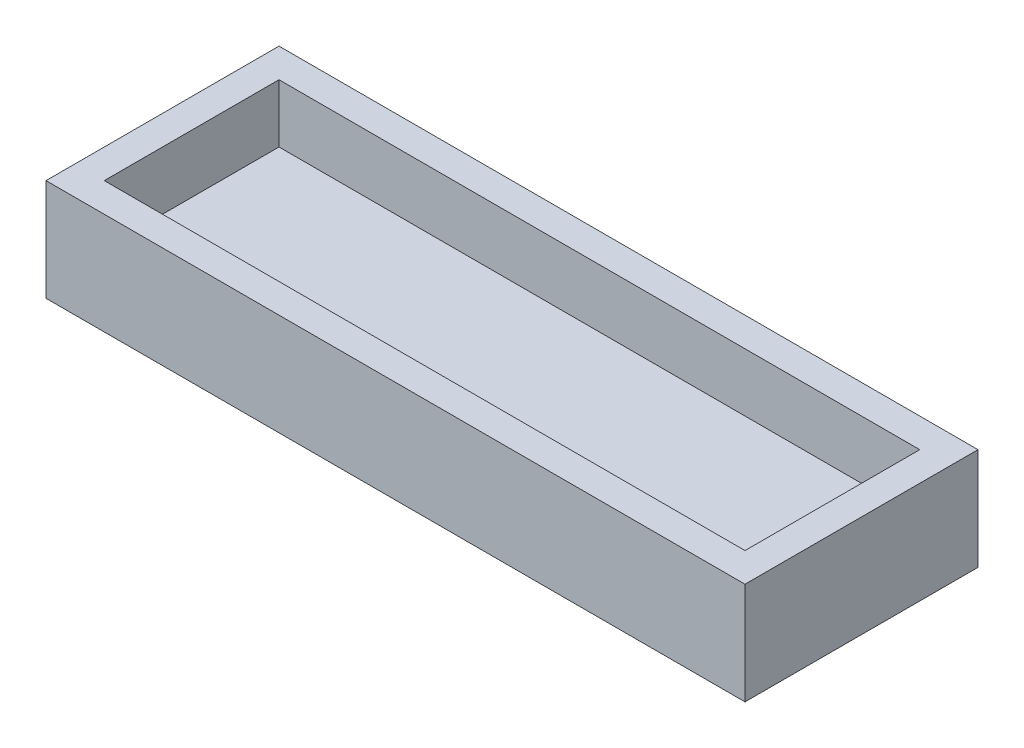
ISO-10303-21;
HEADER;
FILE_DESCRIPTION(('STEP AP214'),'2;1');
FILE_NAME('part.step','',(''),(''),'','','');
FILE_SCHEMA(('AUTOMOTIVE_DESIGN { 1 0 10303 214 1 1 1 1 }'));
ENDSEC;
DATA;
#1=APPLICATION_CONTEXT('core data for automotive mechanical design processes');
#2=APPLICATION_PROTOCOL_DEFINITION('international standard','automotive_design',2000,#1);
#3=PRODUCT_CONTEXT('',#1,'mechanical');
#4=PRODUCT('Part','Part','',(#3));
#5=PRODUCT_RELATED_PRODUCT_CATEGORY('part','',(#4));
#6=PRODUCT_DEFINITION_FORMATION('','',#4);
#7=PRODUCT_DEFINITION_CONTEXT('part definition',#1,'design');
#8=PRODUCT_DEFINITION('design','',#6,#7);
#9=PRODUCT_DEFINITION_SHAPE('','',#8);
#10=(LENGTH_UNIT() NAMED_UNIT(*) SI_UNIT(.MILLI.,.METRE.));
#11=(NAMED_UNIT(*) PLANE_ANGLE_UNIT() SI_UNIT($,.RADIAN.));
#12=(NAMED_UNIT(*) SI_UNIT($,.STERADIAN.) SOLID_ANGLE_UNIT());
#13=UNCERTAINTY_MEASURE_WITH_UNIT(LENGTH_MEASURE(1.E-05),#10,'distance_accuracy_value','');
#14=(GEOMETRIC_REPRESENTATION_CONTEXT(3) GLOBAL_UNCERTAINTY_ASSIGNED_CONTEXT((#13)) GLOBAL_UNIT_ASSIGNED_CONTEXT((#10,
#11,#12)) REPRESENTATION_CONTEXT('',''));
#15=CARTESIAN_POINT('',(0.,0.,0.));
#16=DIRECTION('',(0.,0.,1.));
#17=DIRECTION('',(1.,0.,0.));
#18=AXIS2_PLACEMENT_3D('',#15,#16,#17);
#19=CARTESIAN_POINT('',(0.,3.,0.));
#20=DIRECTION('',(0.,1.,0.));
#21=DIRECTION('',(0.,0.,1.));
#22=AXIS2_PLACEMENT_3D('',#19,#20,#21);
#23=PLANE('',#22);
#24=DIRECTION('',(0.,0.,-1.));
#25=VECTOR('',#24,1.);
#26=CARTESIAN_POINT('',(22.,3.,-6.));
#27=LINE('',#26,#25);
#28=CARTESIAN_POINT('',(22.,3.00000000000002,6.));
#29=VERTEX_POINT('',#28);
#30=CARTESIAN_POINT('',(22.,3.00000000000002,-6.));
#31=VERTEX_POINT('',#30);
#32=EDGE_CURVE('E145',#29,#31,#27,.T.);
#33=ORIENTED_EDGE('',*,*,#32,.T.);
#34=DIRECTION('',(-1.,0.,0.));
#35=VECTOR('',#34,1.);
#36=CARTESIAN_POINT('',(-22.,3.,-6.));
#37=LINE('',#36,#35);
#38=CARTESIAN_POINT('',(-22.,3.,-6.));
#39=VERTEX_POINT('',#38);
#40=EDGE_CURVE('E162',#31,#39,#37,.T.);
#41=ORIENTED_EDGE('',*,*,#40,.T.);
#42=DIRECTION('',(0.,0.,1.));
#43=VECTOR('',#42,1.);
#44=CARTESIAN_POINT('',(-22.,3.,-6.));
#45=LINE('',#44,#43);
#46=CARTESIAN_POINT('',(-22.,3.00000000000002,6.));
#47=VERTEX_POINT('',#46);
#48=EDGE_CURVE('E45',#39,#47,#45,.T.);
#49=ORIENTED_EDGE('',*,*,#48,.T.);
#50=DIRECTION('',(1.,0.,0.));
#51=VECTOR('',#50,1.);
#52=CARTESIAN_POINT('',(-22.,3.,6.));
#53=LINE('',#52,#51);
#54=EDGE_CURVE('E12',#47,#29,#53,.T.);
#55=ORIENTED_EDGE('',*,*,#54,.T.);
#56=EDGE_LOOP('',(#33,#41,#49,#55));
#57=FACE_BOUND('',#56,.T.);
#58=ADVANCED_FACE('F37',(#57),#23,.T.);
#59=CARTESIAN_POINT('',(24.,61.5964425626941,-8.));
#60=DIRECTION('',(0.,0.,-1.));
#61=DIRECTION('',(-1.,0.,0.));
#62=AXIS2_PLACEMENT_3D('',#59,#60,#61);
#63=PLANE('',#62);
#64=DIRECTION('',(0.,-1.,0.));
#65=VECTOR('',#64,1.);
#66=CARTESIAN_POINT('',(-24.,61.5964425626941,-8.));
#67=LINE('',#66,#65);
#68=CARTESIAN_POINT('',(-24.,7.,-8.));
#69=VERTEX_POINT('',#68);
#70=CARTESIAN_POINT('',(-24.,0.,-8.));
#71=VERTEX_POINT('',#70);
#72=EDGE_CURVE('E113',#69,#71,#67,.T.);
#73=ORIENTED_EDGE('',*,*,#72,.F.);
#74=DIRECTION('',(1.,0.,0.));
#75=VECTOR('',#74,1.);
#76=CARTESIAN_POINT('',(24.,7.,-8.));
#77=LINE('',#76,#75);
#78=CARTESIAN_POINT('',(24.,7.,-8.));
#79=VERTEX_POINT('',#78);
#80=EDGE_CURVE('E146',#69,#79,#77,.T.);
#81=ORIENTED_EDGE('',*,*,#80,.T.);
#82=DIRECTION('',(0.,-1.,0.));
#83=VECTOR('',#82,1.);
#84=CARTESIAN_POINT('',(24.,61.5964425626941,-8.));
#85=LINE('',#84,#83);
#86=CARTESIAN_POINT('',(24.,0.,-8.));
#87=VERTEX_POINT('',#86);
#88=EDGE_CURVE('E127',#79,#87,#85,.T.);
#89=ORIENTED_EDGE('',*,*,#88,.T.);
#90=DIRECTION('',(1.,0.,0.));
#91=VECTOR('',#90,1.);
#92=CARTESIAN_POINT('',(24.,0.,-8.));
#93=LINE('',#92,#91);
#94=EDGE_CURVE('E132',#71,#87,#93,.T.);
#95=ORIENTED_EDGE('',*,*,#94,.F.);
#96=EDGE_LOOP('',(#73,#81,#89,#95));
#97=FACE_BOUND('',#96,.T.);
#98=ADVANCED_FACE('F184',(#97),#63,.T.);
#99=CARTESIAN_POINT('',(-24.,61.5964425626941,-8.));
#100=DIRECTION('',(-1.,0.,0.));
#101=DIRECTION('',(0.,0.,1.));
#102=AXIS2_PLACEMENT_3D('',#99,#100,#101);
#103=PLANE('',#102);
#104=DIRECTION('',(0.,-1.,0.));
#105=VECTOR('',#104,1.);
#106=CARTESIAN_POINT('',(-24.,61.5964425626941,8.));
#107=LINE('',#106,#105);
#108=CARTESIAN_POINT('',(-24.,7.,8.));
#109=VERTEX_POINT('',#108);
#110=CARTESIAN_POINT('',(-24.,0.,8.));
#111=VERTEX_POINT('',#110);
#112=EDGE_CURVE('E112',#109,#111,#107,.T.);
#113=ORIENTED_EDGE('',*,*,#112,.F.);
#114=DIRECTION('',(0.,0.,-1.));
#115=VECTOR('',#114,1.);
#116=CARTESIAN_POINT('',(-24.,7.,-8.));
#117=LINE('',#116,#115);
#118=EDGE_CURVE('E109',#109,#69,#117,.T.);
#119=ORIENTED_EDGE('',*,*,#118,.T.);
#120=ORIENTED_EDGE('',*,*,#72,.T.);
#121=DIRECTION('',(0.,0.,-1.));
#122=VECTOR('',#121,1.);
#123=CARTESIAN_POINT('',(-24.,0.,-8.));
#124=LINE('',#123,#122);
#125=EDGE_CURVE('E141',#111,#71,#124,.T.);
#126=ORIENTED_EDGE('',*,*,#125,.F.);
#127=EDGE_LOOP('',(#113,#119,#120,#126));
#128=FACE_BOUND('',#127,.T.);
#129=ADVANCED_FACE('F188',(#128),#103,.T.);
#130=CARTESIAN_POINT('',(24.,61.5964425626941,8.));
#131=DIRECTION('',(0.,0.,1.));
#132=DIRECTION('',(1.,0.,0.));
#133=AXIS2_PLACEMENT_3D('',#130,#131,#132);
#134=PLANE('',#133);
#135=DIRECTION('',(0.,-1.,0.));
#136=VECTOR('',#135,1.);
#137=CARTESIAN_POINT('',(24.,61.5964425626941,8.));
#138=LINE('',#137,#136);
#139=CARTESIAN_POINT('',(24.,7.00000000000001,8.));
#140=VERTEX_POINT('',#139);
#141=CARTESIAN_POINT('',(24.,0.,8.));
#142=VERTEX_POINT('',#141);
#143=EDGE_CURVE('E116',#140,#142,#138,.T.);
#144=ORIENTED_EDGE('',*,*,#143,.F.);
#145=DIRECTION('',(-1.,0.,0.));
#146=VECTOR('',#145,1.);
#147=CARTESIAN_POINT('',(24.,7.,8.));
#148=LINE('',#147,#146);
#149=EDGE_CURVE('E101',#140,#109,#148,.T.);
#150=ORIENTED_EDGE('',*,*,#149,.T.);
#151=ORIENTED_EDGE('',*,*,#112,.T.);
#152=DIRECTION('',(-1.,0.,0.));
#153=VECTOR('',#152,1.);
#154=CARTESIAN_POINT('',(24.,0.,8.));
#155=LINE('',#154,#153);
#156=EDGE_CURVE('E119',#142,#111,#155,.T.);
#157=ORIENTED_EDGE('',*,*,#156,.F.);
#158=EDGE_LOOP('',(#144,#150,#151,#157));
#159=FACE_BOUND('',#158,.T.);
#160=ADVANCED_FACE('F117',(#159),#134,.T.);
#161=CARTESIAN_POINT('',(24.,61.5964425626941,-8.));
#162=DIRECTION('',(1.,0.,0.));
#163=DIRECTION('',(0.,0.,-1.));
#164=AXIS2_PLACEMENT_3D('',#161,#162,#163);
#165=PLANE('',#164);
#166=ORIENTED_EDGE('',*,*,#88,.F.);
#167=DIRECTION('',(0.,0.,1.));
#168=VECTOR('',#167,1.);
#169=CARTESIAN_POINT('',(24.,7.,-8.));
#170=LINE('',#169,#168);
#171=EDGE_CURVE('E106',#79,#140,#170,.T.);
#172=ORIENTED_EDGE('',*,*,#171,.T.);
#173=ORIENTED_EDGE('',*,*,#143,.T.);
#174=DIRECTION('',(0.,0.,1.));
#175=VECTOR('',#174,1.);
#176=CARTESIAN_POINT('',(24.,0.,-8.));
#177=LINE('',#176,#175);
#178=EDGE_CURVE('E270',#87,#142,#177,.T.);
#179=ORIENTED_EDGE('',*,*,#178,.F.);
#180=EDGE_LOOP('',(#166,#172,#173,#179));
#181=FACE_BOUND('',#180,.T.);
#182=ADVANCED_FACE('F126',(#181),#165,.T.);
#183=CARTESIAN_POINT('',(-22.,61.5964425626941,-6.));
#184=DIRECTION('',(-1.,0.,0.));
#185=DIRECTION('',(0.,0.,1.));
#186=AXIS2_PLACEMENT_3D('',#183,#184,#185);
#187=PLANE('',#186);
#188=ORIENTED_EDGE('',*,*,#48,.F.);
#189=DIRECTION('',(0.,-1.,0.));
#190=VECTOR('',#189,1.);
#191=CARTESIAN_POINT('',(-22.,61.5964425626941,-6.));
#192=LINE('',#191,#190);
#193=CARTESIAN_POINT('',(-22.,7.00000000000001,-6.));
#194=VERTEX_POINT('',#193);
#195=EDGE_CURVE('E52',#194,#39,#192,.T.);
#196=ORIENTED_EDGE('',*,*,#195,.F.);
#197=DIRECTION('',(0.,0.,-1.));
#198=VECTOR('',#197,1.);
#199=CARTESIAN_POINT('',(-22.,7.,-6.));
#200=LINE('',#199,#198);
#201=CARTESIAN_POINT('',(-22.,7.00000000000001,6.));
#202=VERTEX_POINT('',#201);
#203=EDGE_CURVE('E134',#202,#194,#200,.T.);
#204=ORIENTED_EDGE('',*,*,#203,.F.);
#205=DIRECTION('',(0.,-1.,0.));
#206=VECTOR('',#205,1.);
#207=CARTESIAN_POINT('',(-22.,61.5964425626941,6.));
#208=LINE('',#207,#206);
#209=EDGE_CURVE('E123',#202,#47,#208,.T.);
#210=ORIENTED_EDGE('',*,*,#209,.T.);
#211=EDGE_LOOP('',(#188,#196,#204,#210));
#212=FACE_BOUND('',#211,.T.);
#213=ADVANCED_FACE('F167',(#212),#187,.F.);
#214=CARTESIAN_POINT('',(22.,61.5964425626941,6.));
#215=DIRECTION('',(0.,0.,1.));
#216=DIRECTION('',(1.,0.,0.));
#217=AXIS2_PLACEMENT_3D('',#214,#215,#216);
#218=PLANE('',#217);
#219=ORIENTED_EDGE('',*,*,#54,.F.);
#220=ORIENTED_EDGE('',*,*,#209,.F.);
#221=DIRECTION('',(-1.,0.,0.));
#222=VECTOR('',#221,1.);
#223=CARTESIAN_POINT('',(22.,7.,6.));
#224=LINE('',#223,#222);
#225=CARTESIAN_POINT('',(22.,7.00000000000001,6.));
#226=VERTEX_POINT('',#225);
#227=EDGE_CURVE('E138',#226,#202,#224,.T.);
#228=ORIENTED_EDGE('',*,*,#227,.F.);
#229=DIRECTION('',(0.,-1.,0.));
#230=VECTOR('',#229,1.);
#231=CARTESIAN_POINT('',(22.,61.5964425626941,6.));
#232=LINE('',#231,#230);
#233=EDGE_CURVE('E154',#226,#29,#232,.T.);
#234=ORIENTED_EDGE('',*,*,#233,.T.);
#235=EDGE_LOOP('',(#219,#220,#228,#234));
#236=FACE_BOUND('',#235,.T.);
#237=ADVANCED_FACE('F168',(#236),#218,.F.);
#238=CARTESIAN_POINT('',(22.,61.5964425626941,-6.));
#239=DIRECTION('',(1.,0.,0.));
#240=DIRECTION('',(0.,0.,-1.));
#241=AXIS2_PLACEMENT_3D('',#238,#239,#240);
#242=PLANE('',#241);
#243=ORIENTED_EDGE('',*,*,#32,.F.);
#244=ORIENTED_EDGE('',*,*,#233,.F.);
#245=DIRECTION('',(0.,0.,1.));
#246=VECTOR('',#245,1.);
#247=CARTESIAN_POINT('',(22.,7.,-6.));
#248=LINE('',#247,#246);
#249=CARTESIAN_POINT('',(22.,7.,-6.));
#250=VERTEX_POINT('',#249);
#251=EDGE_CURVE('E142',#250,#226,#248,.T.);
#252=ORIENTED_EDGE('',*,*,#251,.F.);
#253=DIRECTION('',(0.,-1.,0.));
#254=VECTOR('',#253,1.);
#255=CARTESIAN_POINT('',(22.,61.5964425626941,-6.));
#256=LINE('',#255,#254);
#257=EDGE_CURVE('E156',#250,#31,#256,.T.);
#258=ORIENTED_EDGE('',*,*,#257,.T.);
#259=EDGE_LOOP('',(#243,#244,#252,#258));
#260=FACE_BOUND('',#259,.T.);
#261=ADVANCED_FACE('F172',(#260),#242,.F.);
#262=CARTESIAN_POINT('',(22.,61.5964425626941,-6.));
#263=DIRECTION('',(0.,0.,-1.));
#264=DIRECTION('',(-1.,0.,0.));
#265=AXIS2_PLACEMENT_3D('',#262,#263,#264);
#266=PLANE('',#265);
#267=ORIENTED_EDGE('',*,*,#40,.F.);
#268=ORIENTED_EDGE('',*,*,#257,.F.);
#269=DIRECTION('',(1.,0.,0.));
#270=VECTOR('',#269,1.);
#271=CARTESIAN_POINT('',(22.,7.,-6.));
#272=LINE('',#271,#270);
#273=EDGE_CURVE('E137',#194,#250,#272,.T.);
#274=ORIENTED_EDGE('',*,*,#273,.F.);
#275=ORIENTED_EDGE('',*,*,#195,.T.);
#276=EDGE_LOOP('',(#267,#268,#274,#275));
#277=FACE_BOUND('',#276,.T.);
#278=ADVANCED_FACE('F173',(#277),#266,.F.);
#279=CARTESIAN_POINT('',(0.,7.,0.));
#280=DIRECTION('',(0.,1.,0.));
#281=DIRECTION('',(0.,0.,1.));
#282=AXIS2_PLACEMENT_3D('',#279,#280,#281);
#283=PLANE('',#282);
#284=ORIENTED_EDGE('',*,*,#80,.F.);
#285=ORIENTED_EDGE('',*,*,#118,.F.);
#286=ORIENTED_EDGE('',*,*,#149,.F.);
#287=ORIENTED_EDGE('',*,*,#171,.F.);
#288=EDGE_LOOP('',(#284,#285,#286,#287));
#289=FACE_BOUND('',#288,.T.);
#290=ORIENTED_EDGE('',*,*,#227,.T.);
#291=ORIENTED_EDGE('',*,*,#203,.T.);
#292=ORIENTED_EDGE('',*,*,#273,.T.);
#293=ORIENTED_EDGE('',*,*,#251,.T.);
#294=EDGE_LOOP('',(#290,#291,#292,#293));
#295=FACE_BOUND('',#294,.T.);
#296=ADVANCED_FACE('F103',(#289,#295),#283,.T.);
#297=CARTESIAN_POINT('',(0.,0.,0.));
#298=DIRECTION('',(0.,1.,0.));
#299=DIRECTION('',(0.,0.,1.));
#300=AXIS2_PLACEMENT_3D('',#297,#298,#299);
#301=PLANE('',#300);
#302=ORIENTED_EDGE('',*,*,#94,.T.);
#303=ORIENTED_EDGE('',*,*,#178,.T.);
#304=ORIENTED_EDGE('',*,*,#156,.T.);
#305=ORIENTED_EDGE('',*,*,#125,.T.);
#306=EDGE_LOOP('',(#302,#303,#304,#305));
#307=FACE_BOUND('',#306,.T.);
#308=ADVANCED_FACE('F39',(#307),#301,.F.);
#309=CLOSED_SHELL('',(#58,#98,#129,#160,#182,#213,#237,#261,#278,#296,#308));
#310=MANIFOLD_SOLID_BREP('B2',#309);
#311=ADVANCED_BREP_SHAPE_REPRESENTATION('',(#18,#310),#14);
#312=SHAPE_DEFINITION_REPRESENTATION(#9,#311);
ENDSEC;
END-ISO-10303-21;
